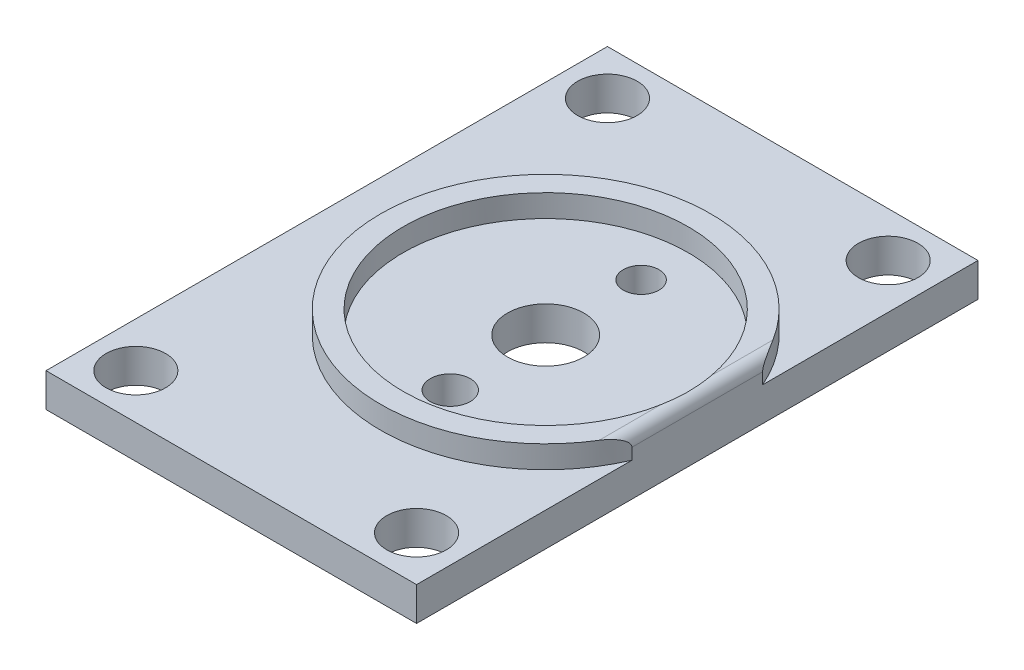
ISO-10303-21;
HEADER;
FILE_DESCRIPTION(('STEP AP214'),'2;1');
FILE_NAME('part.step','',(''),(''),'','','');
FILE_SCHEMA(('AUTOMOTIVE_DESIGN { 1 0 10303 214 1 1 1 1 }'));
ENDSEC;
DATA;
#1=APPLICATION_CONTEXT('core data for automotive mechanical design processes');
#2=APPLICATION_PROTOCOL_DEFINITION('international standard','automotive_design',2000,#1);
#3=PRODUCT_CONTEXT('',#1,'mechanical');
#4=PRODUCT('Part','Part','',(#3));
#5=PRODUCT_RELATED_PRODUCT_CATEGORY('part','',(#4));
#6=PRODUCT_DEFINITION_FORMATION('','',#4);
#7=PRODUCT_DEFINITION_CONTEXT('part definition',#1,'design');
#8=PRODUCT_DEFINITION('design','',#6,#7);
#9=PRODUCT_DEFINITION_SHAPE('','',#8);
#10=(LENGTH_UNIT() NAMED_UNIT(*) SI_UNIT(.MILLI.,.METRE.));
#11=(NAMED_UNIT(*) PLANE_ANGLE_UNIT() SI_UNIT($,.RADIAN.));
#12=(NAMED_UNIT(*) SI_UNIT($,.STERADIAN.) SOLID_ANGLE_UNIT());
#13=UNCERTAINTY_MEASURE_WITH_UNIT(LENGTH_MEASURE(1.E-05),#10,'distance_accuracy_value','');
#14=(GEOMETRIC_REPRESENTATION_CONTEXT(3) GLOBAL_UNCERTAINTY_ASSIGNED_CONTEXT((#13)) GLOBAL_UNIT_ASSIGNED_CONTEXT((#10,
#11,#12)) REPRESENTATION_CONTEXT('',''));
#15=CARTESIAN_POINT('',(0.,0.,0.));
#16=DIRECTION('',(0.,0.,1.));
#17=DIRECTION('',(1.,0.,0.));
#18=AXIS2_PLACEMENT_3D('',#15,#16,#17);
#19=CARTESIAN_POINT('',(0.,3.,0.));
#20=DIRECTION('',(0.,1.,0.));
#21=DIRECTION('',(0.,0.,1.));
#22=AXIS2_PLACEMENT_3D('',#19,#20,#21);
#23=PLANE('',#22);
#24=CARTESIAN_POINT('',(1.27695167286245,3.,-19.8847583643123));
#25=DIRECTION('',(0.,1.,0.));
#26=DIRECTION('',(0.,0.,1.));
#27=AXIS2_PLACEMENT_3D('',#24,#25,#26);
#28=CIRCLE('',#27,1.58978016760219);
#29=CARTESIAN_POINT('',(1.27695167286245,3.,-18.2949781967101));
#30=VERTEX_POINT('',#29);
#31=EDGE_CURVE('E253',#30,#30,#28,.T.);
#32=ORIENTED_EDGE('',*,*,#31,.F.);
#33=EDGE_LOOP('',(#32));
#34=FACE_BOUND('',#33,.T.);
#35=CARTESIAN_POINT('',(1.27695167286245,3.,-2.88475836431227));
#36=DIRECTION('',(0.,1.,0.));
#37=DIRECTION('',(0.,0.,1.));
#38=AXIS2_PLACEMENT_3D('',#35,#36,#37);
#39=CIRCLE('',#38,1.77742826201975);
#40=CARTESIAN_POINT('',(1.27695167286245,3.,-1.10733010229252));
#41=VERTEX_POINT('',#40);
#42=EDGE_CURVE('E257',#41,#41,#39,.T.);
#43=ORIENTED_EDGE('',*,*,#42,.F.);
#44=EDGE_LOOP('',(#43));
#45=FACE_BOUND('',#44,.T.);
#46=CARTESIAN_POINT('',(1.27695167286245,3.,-11.3847583643123));
#47=DIRECTION('',(0.,1.,0.));
#48=DIRECTION('',(0.,0.,1.));
#49=AXIS2_PLACEMENT_3D('',#46,#47,#48);
#50=CIRCLE('',#49,3.4);
#51=CARTESIAN_POINT('',(1.27695167286245,3.,-7.98475836431227));
#52=VERTEX_POINT('',#51);
#53=EDGE_CURVE('E151',#52,#52,#50,.T.);
#54=ORIENTED_EDGE('',*,*,#53,.F.);
#55=EDGE_LOOP('',(#54));
#56=FACE_BOUND('',#55,.T.);
#57=CARTESIAN_POINT('',(1.27695167286245,3.,-11.3847583643123));
#58=DIRECTION('',(0.,1.,0.));
#59=DIRECTION('',(0.,0.,1.));
#60=AXIS2_PLACEMENT_3D('',#57,#58,#59);
#61=CIRCLE('',#60,12.7);
#62=CARTESIAN_POINT('',(1.27695167286245,3.,1.31524163568773));
#63=VERTEX_POINT('',#62);
#64=EDGE_CURVE('E262',#63,#63,#61,.T.);
#65=ORIENTED_EDGE('',*,*,#64,.T.);
#66=EDGE_LOOP('',(#65));
#67=FACE_BOUND('',#66,.T.);
#68=ADVANCED_FACE('F41',(#34,#45,#56,#67),#23,.T.);
#69=CARTESIAN_POINT('',(0.,0.,0.));
#70=DIRECTION('',(0.,1.,0.));
#71=DIRECTION('',(0.,0.,1.));
#72=AXIS2_PLACEMENT_3D('',#69,#70,#71);
#73=PLANE('',#72);
#74=CARTESIAN_POINT('',(1.27695167286245,0.,-19.8847583643123));
#75=DIRECTION('',(0.,1.,0.));
#76=DIRECTION('',(0.,0.,1.));
#77=AXIS2_PLACEMENT_3D('',#74,#75,#76);
#78=CIRCLE('',#77,1.58978016760219);
#79=CARTESIAN_POINT('',(1.27695167286245,0.,-18.2949781967101));
#80=VERTEX_POINT('',#79);
#81=EDGE_CURVE('E266',#80,#80,#78,.T.);
#82=ORIENTED_EDGE('',*,*,#81,.T.);
#83=EDGE_LOOP('',(#82));
#84=FACE_BOUND('',#83,.T.);
#85=CARTESIAN_POINT('',(1.27695167286245,0.,-2.88475836431227));
#86=DIRECTION('',(0.,1.,0.));
#87=DIRECTION('',(0.,0.,1.));
#88=AXIS2_PLACEMENT_3D('',#85,#86,#87);
#89=CIRCLE('',#88,1.77742826201975);
#90=CARTESIAN_POINT('',(1.27695167286245,0.,-1.10733010229252));
#91=VERTEX_POINT('',#90);
#92=EDGE_CURVE('E274',#91,#91,#89,.T.);
#93=ORIENTED_EDGE('',*,*,#92,.T.);
#94=EDGE_LOOP('',(#93));
#95=FACE_BOUND('',#94,.T.);
#96=CARTESIAN_POINT('',(10.7769516728624,0.,-32.3847583643123));
#97=DIRECTION('',(0.,1.,0.));
#98=DIRECTION('',(0.,0.,1.));
#99=AXIS2_PLACEMENT_3D('',#96,#97,#98);
#100=CIRCLE('',#99,2.65);
#101=CARTESIAN_POINT('',(10.7769516728624,0.,-29.7347583643123));
#102=VERTEX_POINT('',#101);
#103=EDGE_CURVE('E297',#102,#102,#100,.F.);
#104=ORIENTED_EDGE('',*,*,#103,.F.);
#105=EDGE_LOOP('',(#104));
#106=FACE_BOUND('',#105,.T.);
#107=CARTESIAN_POINT('',(10.7769516728625,0.,9.61524163568773));
#108=DIRECTION('',(0.,1.,0.));
#109=DIRECTION('',(0.,0.,1.));
#110=AXIS2_PLACEMENT_3D('',#107,#108,#109);
#111=CIRCLE('',#110,2.65);
#112=CARTESIAN_POINT('',(10.7769516728625,0.,12.2652416356877));
#113=VERTEX_POINT('',#112);
#114=EDGE_CURVE('E290',#113,#113,#111,.F.);
#115=ORIENTED_EDGE('',*,*,#114,.F.);
#116=EDGE_LOOP('',(#115));
#117=FACE_BOUND('',#116,.T.);
#118=CARTESIAN_POINT('',(1.27695167286245,0.,-11.3847583643123));
#119=DIRECTION('',(0.,1.,0.));
#120=DIRECTION('',(0.,0.,1.));
#121=AXIS2_PLACEMENT_3D('',#118,#119,#120);
#122=CIRCLE('',#121,3.4);
#123=CARTESIAN_POINT('',(1.27695167286245,0.,-7.98475836431227));
#124=VERTEX_POINT('',#123);
#125=EDGE_CURVE('E150',#124,#124,#122,.T.);
#126=ORIENTED_EDGE('',*,*,#125,.T.);
#127=EDGE_LOOP('',(#126));
#128=FACE_BOUND('',#127,.T.);
#129=DIRECTION('',(1.,0.,0.));
#130=VECTOR('',#129,1.);
#131=CARTESIAN_POINT('',(-10.2230483271375,0.,13.6152416356877));
#132=LINE('',#131,#130);
#133=CARTESIAN_POINT('',(-18.2230483271375,0.,13.6152416356877));
#134=VERTEX_POINT('',#133);
#135=CARTESIAN_POINT('',(14.7769516728625,0.,13.6152416356877));
#136=VERTEX_POINT('',#135);
#137=EDGE_CURVE('E127',#134,#136,#132,.T.);
#138=ORIENTED_EDGE('',*,*,#137,.F.);
#139=DIRECTION('',(0.,0.,1.));
#140=VECTOR('',#139,1.);
#141=CARTESIAN_POINT('',(-18.2230483271375,0.,-36.3847583643123));
#142=LINE('',#141,#140);
#143=CARTESIAN_POINT('',(-18.2230483271375,0.,-36.3847583643123));
#144=VERTEX_POINT('',#143);
#145=EDGE_CURVE('E124',#144,#134,#142,.T.);
#146=ORIENTED_EDGE('',*,*,#145,.F.);
#147=DIRECTION('',(-1.,0.,0.));
#148=VECTOR('',#147,1.);
#149=CARTESIAN_POINT('',(-10.2230483271376,0.,-36.3847583643123));
#150=LINE('',#149,#148);
#151=CARTESIAN_POINT('',(14.7769516728625,0.,-36.3847583643123));
#152=VERTEX_POINT('',#151);
#153=EDGE_CURVE('E109',#152,#144,#150,.T.);
#154=ORIENTED_EDGE('',*,*,#153,.F.);
#155=DIRECTION('',(0.,0.,-1.));
#156=VECTOR('',#155,1.);
#157=CARTESIAN_POINT('',(14.7769516728625,0.,-36.3847583643123));
#158=LINE('',#157,#156);
#159=EDGE_CURVE('E121',#136,#152,#158,.T.);
#160=ORIENTED_EDGE('',*,*,#159,.F.);
#161=EDGE_LOOP('',(#138,#146,#154,#160));
#162=FACE_BOUND('',#161,.T.);
#163=CARTESIAN_POINT('',(-14.2230483271375,0.,-32.3847583643123));
#164=DIRECTION('',(0.,1.,0.));
#165=DIRECTION('',(0.,0.,1.));
#166=AXIS2_PLACEMENT_3D('',#163,#164,#165);
#167=CIRCLE('',#166,2.65);
#168=CARTESIAN_POINT('',(-14.2230483271375,0.,-29.7347583643123));
#169=VERTEX_POINT('',#168);
#170=EDGE_CURVE('E46',#169,#169,#167,.F.);
#171=ORIENTED_EDGE('',*,*,#170,.F.);
#172=EDGE_LOOP('',(#171));
#173=FACE_BOUND('',#172,.T.);
#174=CARTESIAN_POINT('',(-14.2230483271375,0.,9.61524163568773));
#175=DIRECTION('',(0.,1.,0.));
#176=DIRECTION('',(0.,0.,1.));
#177=AXIS2_PLACEMENT_3D('',#174,#175,#176);
#178=CIRCLE('',#177,2.65);
#179=CARTESIAN_POINT('',(-14.2230483271375,0.,12.2652416356877));
#180=VERTEX_POINT('',#179);
#181=EDGE_CURVE('E322',#180,#180,#178,.F.);
#182=ORIENTED_EDGE('',*,*,#181,.F.);
#183=EDGE_LOOP('',(#182));
#184=FACE_BOUND('',#183,.T.);
#185=ADVANCED_FACE('F125',(#84,#95,#106,#117,#128,#162,#173,#184),#73,.F.);
#186=CARTESIAN_POINT('',(1.27695167286245,3.,-11.3847583643123));
#187=DIRECTION('',(0.,1.,0.));
#188=DIRECTION('',(0.,0.,1.));
#189=AXIS2_PLACEMENT_3D('',#186,#187,#188);
#190=CIRCLE('',#189,14.7);
#191=CARTESIAN_POINT('',(14.7769516728625,3.,-17.2019741932119));
#192=VERTEX_POINT('',#191);
#193=CARTESIAN_POINT('',(14.7769516728625,3.,-5.56754253541269));
#194=VERTEX_POINT('',#193);
#195=EDGE_CURVE('E265',#192,#194,#190,.T.);
#196=ORIENTED_EDGE('',*,*,#195,.F.);
#197=DIRECTION('',(0.,0.,-1.));
#198=VECTOR('',#197,1.);
#199=CARTESIAN_POINT('',(14.7769516728625,3.,-36.3847583643123));
#200=LINE('',#199,#198);
#201=CARTESIAN_POINT('',(14.7769516728625,3.,-36.3847583643123));
#202=VERTEX_POINT('',#201);
#203=EDGE_CURVE('E160',#192,#202,#200,.T.);
#204=ORIENTED_EDGE('',*,*,#203,.T.);
#205=DIRECTION('',(-1.,0.,0.));
#206=VECTOR('',#205,1.);
#207=CARTESIAN_POINT('',(-10.2230483271376,3.,-36.3847583643123));
#208=LINE('',#207,#206);
#209=CARTESIAN_POINT('',(-18.2230483271376,3.,-36.3847583643123));
#210=VERTEX_POINT('',#209);
#211=EDGE_CURVE('E165',#202,#210,#208,.T.);
#212=ORIENTED_EDGE('',*,*,#211,.T.);
#213=DIRECTION('',(0.,0.,-1.));
#214=VECTOR('',#213,1.);
#215=CARTESIAN_POINT('',(-18.2230483271376,3.,-36.3847583643123));
#216=LINE('',#215,#214);
#217=CARTESIAN_POINT('',(-18.2230483271375,3.,13.6152416356877));
#218=VERTEX_POINT('',#217);
#219=EDGE_CURVE('E135',#218,#210,#216,.T.);
#220=ORIENTED_EDGE('',*,*,#219,.F.);
#221=DIRECTION('',(1.,0.,0.));
#222=VECTOR('',#221,1.);
#223=CARTESIAN_POINT('',(-10.2230483271375,3.,13.6152416356877));
#224=LINE('',#223,#222);
#225=CARTESIAN_POINT('',(14.7769516728625,3.,13.6152416356877));
#226=VERTEX_POINT('',#225);
#227=EDGE_CURVE('E120',#218,#226,#224,.T.);
#228=ORIENTED_EDGE('',*,*,#227,.T.);
#229=EDGE_CURVE('E161',#226,#194,#200,.T.);
#230=ORIENTED_EDGE('',*,*,#229,.T.);
#231=EDGE_LOOP('',(#196,#204,#212,#220,#228,#230));
#232=FACE_BOUND('',#231,.T.);
#233=CARTESIAN_POINT('',(10.7769516728624,3.,-32.3847583643123));
#234=DIRECTION('',(0.,-1.,0.));
#235=DIRECTION('',(0.,0.,1.));
#236=AXIS2_PLACEMENT_3D('',#233,#234,#235);
#237=CIRCLE('',#236,2.65);
#238=CARTESIAN_POINT('',(10.7769516728624,3.,-29.7347583643123));
#239=VERTEX_POINT('',#238);
#240=EDGE_CURVE('E286',#239,#239,#237,.T.);
#241=ORIENTED_EDGE('',*,*,#240,.T.);
#242=EDGE_LOOP('',(#241));
#243=FACE_BOUND('',#242,.T.);
#244=CARTESIAN_POINT('',(10.7769516728625,3.,9.61524163568773));
#245=DIRECTION('',(0.,-1.,0.));
#246=DIRECTION('',(0.,0.,1.));
#247=AXIS2_PLACEMENT_3D('',#244,#245,#246);
#248=CIRCLE('',#247,2.65);
#249=CARTESIAN_POINT('',(10.7769516728625,3.,12.2652416356877));
#250=VERTEX_POINT('',#249);
#251=EDGE_CURVE('E285',#250,#250,#248,.T.);
#252=ORIENTED_EDGE('',*,*,#251,.T.);
#253=EDGE_LOOP('',(#252));
#254=FACE_BOUND('',#253,.T.);
#255=CARTESIAN_POINT('',(-14.2230483271375,3.,-32.3847583643123));
#256=DIRECTION('',(0.,1.,0.));
#257=DIRECTION('',(0.,0.,1.));
#258=AXIS2_PLACEMENT_3D('',#255,#256,#257);
#259=CIRCLE('',#258,2.65);
#260=CARTESIAN_POINT('',(-14.2230483271375,3.,-29.7347583643123));
#261=VERTEX_POINT('',#260);
#262=EDGE_CURVE('E138',#261,#261,#259,.T.);
#263=ORIENTED_EDGE('',*,*,#262,.F.);
#264=EDGE_LOOP('',(#263));
#265=FACE_BOUND('',#264,.T.);
#266=CARTESIAN_POINT('',(-14.2230483271375,3.,9.61524163568773));
#267=DIRECTION('',(0.,1.,0.));
#268=DIRECTION('',(0.,0.,1.));
#269=AXIS2_PLACEMENT_3D('',#266,#267,#268);
#270=CIRCLE('',#269,2.65);
#271=CARTESIAN_POINT('',(-14.2230483271375,3.,12.2652416356877));
#272=VERTEX_POINT('',#271);
#273=EDGE_CURVE('E144',#272,#272,#270,.T.);
#274=ORIENTED_EDGE('',*,*,#273,.F.);
#275=EDGE_LOOP('',(#274));
#276=FACE_BOUND('',#275,.T.);
#277=ADVANCED_FACE('F230',(#232,#243,#254,#265,#276),#23,.T.);
#278=CARTESIAN_POINT('',(-10.2230483271375,3.,13.6152416356877));
#279=DIRECTION('',(0.,0.,-1.));
#280=DIRECTION('',(-1.,0.,0.));
#281=AXIS2_PLACEMENT_3D('',#278,#279,#280);
#282=PLANE('',#281);
#283=DIRECTION('',(0.,1.,0.));
#284=VECTOR('',#283,1.);
#285=CARTESIAN_POINT('',(-18.2230483271375,3.,13.6152416356877));
#286=LINE('',#285,#284);
#287=EDGE_CURVE('E137',#134,#218,#286,.T.);
#288=ORIENTED_EDGE('',*,*,#287,.F.);
#289=ORIENTED_EDGE('',*,*,#137,.T.);
#290=DIRECTION('',(0.,-1.,0.));
#291=VECTOR('',#290,1.);
#292=CARTESIAN_POINT('',(14.7769516728625,3.,13.6152416356877));
#293=LINE('',#292,#291);
#294=EDGE_CURVE('E174',#226,#136,#293,.T.);
#295=ORIENTED_EDGE('',*,*,#294,.F.);
#296=ORIENTED_EDGE('',*,*,#227,.F.);
#297=EDGE_LOOP('',(#288,#289,#295,#296));
#298=FACE_BOUND('',#297,.T.);
#299=ADVANCED_FACE('F233',(#298),#282,.F.);
#300=CARTESIAN_POINT('',(14.7769516728625,3.,-36.3847583643123));
#301=DIRECTION('',(-1.,0.,0.));
#302=DIRECTION('',(0.,0.,1.));
#303=AXIS2_PLACEMENT_3D('',#300,#301,#302);
#304=PLANE('',#303);
#305=DIRECTION('',(0.,-1.,0.));
#306=VECTOR('',#305,1.);
#307=CARTESIAN_POINT('',(14.7769516728625,5.,-17.2019741932119));
#308=LINE('',#307,#306);
#309=CARTESIAN_POINT('',(14.7769516728625,4.,-17.2019741932119));
#310=VERTEX_POINT('',#309);
#311=EDGE_CURVE('E282',#310,#192,#308,.T.);
#312=ORIENTED_EDGE('',*,*,#311,.F.);
#313=DIRECTION('',(0.,0.,-1.));
#314=VECTOR('',#313,1.);
#315=CARTESIAN_POINT('',(14.7769516728625,4.,-5.56754253541269));
#316=LINE('',#315,#314);
#317=CARTESIAN_POINT('',(14.7769516728625,4.,-5.56754253541269));
#318=VERTEX_POINT('',#317);
#319=EDGE_CURVE('E11',#310,#318,#316,.F.);
#320=ORIENTED_EDGE('',*,*,#319,.T.);
#321=DIRECTION('',(0.,-1.,0.));
#322=VECTOR('',#321,1.);
#323=CARTESIAN_POINT('',(14.7769516728625,5.,-5.56754253541269));
#324=LINE('',#323,#322);
#325=EDGE_CURVE('E279',#318,#194,#324,.T.);
#326=ORIENTED_EDGE('',*,*,#325,.T.);
#327=ORIENTED_EDGE('',*,*,#229,.F.);
#328=ORIENTED_EDGE('',*,*,#294,.T.);
#329=ORIENTED_EDGE('',*,*,#159,.T.);
#330=DIRECTION('',(0.,-1.,0.));
#331=VECTOR('',#330,1.);
#332=CARTESIAN_POINT('',(14.7769516728625,3.,-36.3847583643123));
#333=LINE('',#332,#331);
#334=EDGE_CURVE('E116',#202,#152,#333,.T.);
#335=ORIENTED_EDGE('',*,*,#334,.F.);
#336=ORIENTED_EDGE('',*,*,#203,.F.);
#337=EDGE_LOOP('',(#312,#320,#326,#327,#328,#329,#335,#336));
#338=FACE_BOUND('',#337,.T.);
#339=ADVANCED_FACE('F240',(#338),#304,.F.);
#340=CARTESIAN_POINT('',(-10.2230483271376,3.,-36.3847583643123));
#341=DIRECTION('',(0.,0.,1.));
#342=DIRECTION('',(1.,0.,0.));
#343=AXIS2_PLACEMENT_3D('',#340,#341,#342);
#344=PLANE('',#343);
#345=ORIENTED_EDGE('',*,*,#153,.T.);
#346=DIRECTION('',(0.,-1.,0.));
#347=VECTOR('',#346,1.);
#348=CARTESIAN_POINT('',(-18.2230483271376,3.,-36.3847583643123));
#349=LINE('',#348,#347);
#350=EDGE_CURVE('E114',#210,#144,#349,.T.);
#351=ORIENTED_EDGE('',*,*,#350,.F.);
#352=ORIENTED_EDGE('',*,*,#211,.F.);
#353=ORIENTED_EDGE('',*,*,#334,.T.);
#354=EDGE_LOOP('',(#345,#351,#352,#353));
#355=FACE_BOUND('',#354,.T.);
#356=ADVANCED_FACE('F111',(#355),#344,.F.);
#357=CARTESIAN_POINT('',(1.27695167286245,3.,-11.3847583643123));
#358=DIRECTION('',(0.,-1.,0.));
#359=DIRECTION('',(0.,0.,-1.));
#360=AXIS2_PLACEMENT_3D('',#357,#358,#359);
#361=CYLINDRICAL_SURFACE('',#360,3.4);
#362=ORIENTED_EDGE('',*,*,#53,.T.);
#363=EDGE_LOOP('',(#362));
#364=FACE_BOUND('',#363,.T.);
#365=ORIENTED_EDGE('',*,*,#125,.F.);
#366=EDGE_LOOP('',(#365));
#367=FACE_BOUND('',#366,.T.);
#368=ADVANCED_FACE('F226',(#364,#367),#361,.F.);
#369=CARTESIAN_POINT('',(-18.2230483271375,0.,0.));
#370=DIRECTION('',(-1.,0.,0.));
#371=DIRECTION('',(0.,0.,1.));
#372=AXIS2_PLACEMENT_3D('',#369,#370,#371);
#373=PLANE('',#372);
#374=ORIENTED_EDGE('',*,*,#145,.T.);
#375=ORIENTED_EDGE('',*,*,#287,.T.);
#376=ORIENTED_EDGE('',*,*,#219,.T.);
#377=ORIENTED_EDGE('',*,*,#350,.T.);
#378=EDGE_LOOP('',(#374,#375,#376,#377));
#379=FACE_BOUND('',#378,.T.);
#380=ADVANCED_FACE('F133',(#379),#373,.T.);
#381=CARTESIAN_POINT('',(-14.2230483271375,-0.3,9.61524163568773));
#382=DIRECTION('',(0.,1.,0.));
#383=DIRECTION('',(0.,0.,1.));
#384=AXIS2_PLACEMENT_3D('',#381,#382,#383);
#385=CYLINDRICAL_SURFACE('',#384,2.65);
#386=ORIENTED_EDGE('',*,*,#181,.T.);
#387=EDGE_LOOP('',(#386));
#388=FACE_BOUND('',#387,.T.);
#389=ORIENTED_EDGE('',*,*,#273,.T.);
#390=EDGE_LOOP('',(#389));
#391=FACE_BOUND('',#390,.T.);
#392=ADVANCED_FACE('F219',(#388,#391),#385,.F.);
#393=CARTESIAN_POINT('',(-14.2230483271375,-0.3,-32.3847583643123));
#394=DIRECTION('',(0.,1.,0.));
#395=DIRECTION('',(0.,0.,1.));
#396=AXIS2_PLACEMENT_3D('',#393,#394,#395);
#397=CYLINDRICAL_SURFACE('',#396,2.65);
#398=ORIENTED_EDGE('',*,*,#170,.T.);
#399=EDGE_LOOP('',(#398));
#400=FACE_BOUND('',#399,.T.);
#401=ORIENTED_EDGE('',*,*,#262,.T.);
#402=EDGE_LOOP('',(#401));
#403=FACE_BOUND('',#402,.T.);
#404=ADVANCED_FACE('F215',(#400,#403),#397,.F.);
#405=CARTESIAN_POINT('',(10.7769516728625,-0.3,9.61524163568773));
#406=DIRECTION('',(0.,1.,0.));
#407=DIRECTION('',(0.,0.,1.));
#408=AXIS2_PLACEMENT_3D('',#405,#406,#407);
#409=CYLINDRICAL_SURFACE('',#408,2.65);
#410=ORIENTED_EDGE('',*,*,#251,.F.);
#411=EDGE_LOOP('',(#410));
#412=FACE_BOUND('',#411,.T.);
#413=ORIENTED_EDGE('',*,*,#114,.T.);
#414=EDGE_LOOP('',(#413));
#415=FACE_BOUND('',#414,.T.);
#416=ADVANCED_FACE('F211',(#412,#415),#409,.F.);
#417=CARTESIAN_POINT('',(10.7769516728624,-0.3,-32.3847583643123));
#418=DIRECTION('',(0.,1.,0.));
#419=DIRECTION('',(0.,0.,1.));
#420=AXIS2_PLACEMENT_3D('',#417,#418,#419);
#421=CYLINDRICAL_SURFACE('',#420,2.65);
#422=ORIENTED_EDGE('',*,*,#240,.F.);
#423=EDGE_LOOP('',(#422));
#424=FACE_BOUND('',#423,.T.);
#425=ORIENTED_EDGE('',*,*,#103,.T.);
#426=EDGE_LOOP('',(#425));
#427=FACE_BOUND('',#426,.T.);
#428=ADVANCED_FACE('F205',(#424,#427),#421,.F.);
#429=CARTESIAN_POINT('',(1.27695167286245,5.,-11.3847583643123));
#430=DIRECTION('',(0.,-1.,0.));
#431=DIRECTION('',(0.,0.,-1.));
#432=AXIS2_PLACEMENT_3D('',#429,#430,#431);
#433=CYLINDRICAL_SURFACE('',#432,12.7);
#434=CARTESIAN_POINT('',(1.27695167286245,5.,-11.3847583643123));
#435=DIRECTION('',(0.,1.,0.));
#436=DIRECTION('',(0.,0.,1.));
#437=AXIS2_PLACEMENT_3D('',#434,#435,#436);
#438=CIRCLE('',#437,12.7);
#439=CARTESIAN_POINT('',(13.7769516728625,5.,-13.6297527963766));
#440=VERTEX_POINT('',#439);
#441=CARTESIAN_POINT('',(13.7769516728625,5.,-9.13976393224791));
#442=VERTEX_POINT('',#441);
#443=EDGE_CURVE('E271',#440,#442,#438,.T.);
#444=ORIENTED_EDGE('',*,*,#443,.T.);
#445=CARTESIAN_POINT('',(13.7769516728625,5.,-9.13976393224791));
#446=CARTESIAN_POINT('',(13.7917982648946,4.99999666393264,-9.22242883608441));
#447=CARTESIAN_POINT('',(13.8058241827349,4.99966981555627,-9.30523762198722));
#448=CARTESIAN_POINT('',(13.8322299971182,4.99855905949372,-9.47111282776791));
#449=CARTESIAN_POINT('',(13.8446099229139,4.99777515993167,-9.5541792430403));
#450=CARTESIAN_POINT('',(13.8792729985578,4.99502291514125,-9.80371369877026));
#451=CARTESIAN_POINT('',(13.8990813141116,4.99265397562916,-9.97052734806752));
#452=CARTESIAN_POINT('',(13.9319490481331,4.98805312892272,-10.3036234391423));
#453=CARTESIAN_POINT('',(13.9450552287151,4.9858203707205,-10.4699012877852));
#454=CARTESIAN_POINT('',(13.9647095921097,4.982265656693,-10.8028559893748));
#455=CARTESIAN_POINT('',(13.9712577108323,4.98094370976884,-10.969532846205));
#456=CARTESIAN_POINT('',(13.9785871566708,4.97947302630847,-11.3440895614154));
#457=CARTESIAN_POINT('',(13.9775513656986,4.97969334915199,-11.5520086493808));
#458=CARTESIAN_POINT('',(13.9652751859536,4.98212691271205,-11.9675603732358));
#459=CARTESIAN_POINT('',(13.9540336743221,4.98434037271823,-12.1751929750881));
#460=CARTESIAN_POINT('',(13.9294696825212,4.98833327170211,-12.486931647102));
#461=CARTESIAN_POINT('',(13.9199386892982,4.98978427249376,-12.591354412072));
#462=CARTESIAN_POINT('',(13.8982935093669,4.99267134051921,-12.7999341621755));
#463=CARTESIAN_POINT('',(13.8861793302054,4.99410740779664,-12.9040911480846));
#464=CARTESIAN_POINT('',(13.8593761247133,4.99668878187041,-13.1120644593689));
#465=CARTESIAN_POINT('',(13.8446874005908,4.99783412275453,-13.2158808232718));
#466=CARTESIAN_POINT('',(13.8127427272464,4.99948463129596,-13.4231246441708));
#467=CARTESIAN_POINT('',(13.7954867279227,4.99998978645787,-13.5265520935365));
#468=CARTESIAN_POINT('',(13.7769516728625,5.,-13.6297527963766));
#469=B_SPLINE_CURVE_WITH_KNOTS('',3,(#445,#446,#447,#448,#449,#450,#451,#452,#453,#454,#455,
#456,#457,#458,#459,#460,#461,#462,#463,#464,#465,#466,#467,#468),.UNSPECIFIED.,.F.,.F.,(4,2,2,
2,2,2,2,2,2,2,2,4),(0.,0.251951724219675,0.503898970110917,1.0077617893011,1.50805937515915,
2.00836185023315,2.63186235615105,3.2554314694485,3.57000566075406,3.88457893303305,
4.19911530442203,4.51365781496104),.UNSPECIFIED.);
#470=EDGE_CURVE('E185',#442,#440,#469,.T.);
#471=ORIENTED_EDGE('',*,*,#470,.T.);
#472=EDGE_LOOP('',(#444,#471));
#473=FACE_BOUND('',#472,.T.);
#474=ORIENTED_EDGE('',*,*,#64,.F.);
#475=EDGE_LOOP('',(#474));
#476=FACE_BOUND('',#475,.T.);
#477=ADVANCED_FACE('F200',(#473,#476),#433,.F.);
#478=CARTESIAN_POINT('',(1.27695167286245,5.,-11.3847583643123));
#479=DIRECTION('',(0.,-1.,0.));
#480=DIRECTION('',(0.,0.,-1.));
#481=AXIS2_PLACEMENT_3D('',#478,#479,#480);
#482=CYLINDRICAL_SURFACE('',#481,14.7);
#483=CARTESIAN_POINT('',(1.27695167286245,5.,-11.3847583643123));
#484=DIRECTION('',(0.,1.,0.));
#485=DIRECTION('',(0.,0.,1.));
#486=AXIS2_PLACEMENT_3D('',#483,#484,#485);
#487=CIRCLE('',#486,14.7);
#488=CARTESIAN_POINT('',(13.7769516728625,5.,-19.1203902066378));
#489=VERTEX_POINT('',#488);
#490=CARTESIAN_POINT('',(13.7769516728625,5.,-3.64912652198679));
#491=VERTEX_POINT('',#490);
#492=EDGE_CURVE('E276',#489,#491,#487,.T.);
#493=ORIENTED_EDGE('',*,*,#492,.F.);
#494=CARTESIAN_POINT('',(13.7769516728625,5.,-19.1203902066378));
#495=CARTESIAN_POINT('',(13.804852368223,4.9999954869858,-19.0753061888042));
#496=CARTESIAN_POINT('',(13.832502937192,4.99883293515778,-19.0300797188275));
#497=CARTESIAN_POINT('',(13.8872628706643,4.99427760957824,-18.9394161721947));
#498=CARTESIAN_POINT('',(13.9143722777845,4.9908850121644,-18.8939791124727));
#499=CARTESIAN_POINT('',(13.9949206253484,4.97747619195145,-18.7573055899291));
#500=CARTESIAN_POINT('',(14.0474892285777,4.96422949908699,-18.6658530078683));
#501=CARTESIAN_POINT('',(14.1492391259875,4.92964922229002,-18.484398319347));
#502=CARTESIAN_POINT('',(14.1984584085419,4.90843534248119,-18.3943943606808));
#503=CARTESIAN_POINT('',(14.2940184721401,4.85765630451537,-18.215295886609));
#504=CARTESIAN_POINT('',(14.3403623000959,4.82810017697294,-18.1262004951361));
#505=CARTESIAN_POINT('',(14.4133219773777,4.7722005267082,-17.9824611845864));
#506=CARTESIAN_POINT('',(14.4409190458115,4.74868073896599,-17.9272104270308));
#507=CARTESIAN_POINT('',(14.4948416459913,4.69716517838304,-17.817575200898));
#508=CARTESIAN_POINT('',(14.5211567033167,4.66913867397831,-17.7631997231175));
#509=CARTESIAN_POINT('',(14.5637646785544,4.61777688642314,-17.6738125008723));
#510=CARTESIAN_POINT('',(14.5805473185861,4.59585416926962,-17.6382237395724));
#511=CARTESIAN_POINT('',(14.6131471571876,4.54917205554668,-17.5683958889449));
#512=CARTESIAN_POINT('',(14.6289631897218,4.52440933267153,-17.5341584467005));
#513=CARTESIAN_POINT('',(14.6592067346695,4.47174300492469,-17.4680599708097));
#514=CARTESIAN_POINT('',(14.673645271814,4.44386905591497,-17.4361806273127));
#515=CARTESIAN_POINT('',(14.7008163294829,4.38412106538178,-17.3756637382121));
#516=CARTESIAN_POINT('',(14.713553949372,4.35225956163003,-17.3470165445615));
#517=CARTESIAN_POINT('',(14.7324305007182,4.2959679762253,-17.3042539558129));
#518=CARTESIAN_POINT('',(14.7392995684892,4.27295905041984,-17.2886069801691));
#519=CARTESIAN_POINT('',(14.751674598352,4.22479253232095,-17.2603076781505));
#520=CARTESIAN_POINT('',(14.7571814576979,4.19963636913021,-17.2476533808126));
#521=CARTESIAN_POINT('',(14.7656840546325,4.15136900747075,-17.2280618159638));
#522=CARTESIAN_POINT('',(14.7689364224677,4.12854313994863,-17.2205430785036));
#523=CARTESIAN_POINT('',(14.7738684475927,4.08186303400441,-17.2091277885398));
#524=CARTESIAN_POINT('',(14.7755523157903,4.058011729921,-17.2052215378958));
#525=CARTESIAN_POINT('',(14.7767604298796,4.02268622155709,-17.202417806813));
#526=CARTESIAN_POINT('',(14.7769559862048,4.01134201920128,-17.2019636177184));
#527=CARTESIAN_POINT('',(14.7769516728625,4.,-17.2019741932119));
#528=B_SPLINE_CURVE_WITH_KNOTS('',3,(#494,#495,#496,#497,#498,#499,#500,#501,#502,#503,#504,
#505,#506,#507,#508,#509,#510,#511,#512,#513,#514,#515,#516,#517,#518,#519,#520,#521,#522,#523,
#524,#525,#526,#527),.UNSPECIFIED.,.F.,.F.,(4,2,2,2,2,2,2,2,2,2,2,2,2,2,2,2,4),(0.,
0.159024980973563,0.318037388786538,0.636576370945678,0.950509358150242,1.26410380281102,
1.46223860105219,1.66178674466198,1.79682354994621,1.93202016169716,2.06602332169286,
2.19961525973189,2.28539772771844,2.37112354147929,2.44359284038567,2.51586701742765,
2.54989177646313),.UNSPECIFIED.);
#529=EDGE_CURVE('E52',#489,#310,#528,.T.);
#530=ORIENTED_EDGE('',*,*,#529,.T.);
#531=ORIENTED_EDGE('',*,*,#311,.T.);
#532=ORIENTED_EDGE('',*,*,#195,.T.);
#533=ORIENTED_EDGE('',*,*,#325,.F.);
#534=CARTESIAN_POINT('',(14.7769516728625,4.,-5.56754253541269));
#535=CARTESIAN_POINT('',(14.7769798518988,4.02508472034533,-5.56761243459964));
#536=CARTESIAN_POINT('',(14.7760092835958,4.05006458511525,-5.56535528123019));
#537=CARTESIAN_POINT('',(14.7723404109595,4.09887928973539,-5.55684990943588));
#538=CARTESIAN_POINT('',(14.7696650287718,4.1227248766999,-5.5506546437256));
#539=CARTESIAN_POINT('',(14.7619269452442,4.17525286383017,-5.53278839792091));
#540=CARTESIAN_POINT('',(14.7564157765521,4.20351195595343,-5.52009303598014));
#541=CARTESIAN_POINT('',(14.7436115535946,4.25757530833313,-5.49075020211459));
#542=CARTESIAN_POINT('',(14.7363085276445,4.28336466761049,-5.47408062893565));
#543=CARTESIAN_POINT('',(14.7147915949918,4.34986961273874,-5.42526399701179));
#544=CARTESIAN_POINT('',(14.6993430879138,4.38824106355493,-5.39050895249528));
#545=CARTESIAN_POINT('',(14.6661177265775,4.45926087093653,-5.3166536861603));
#546=CARTESIAN_POINT('',(14.6483356752208,4.49189606092934,-5.27754379590936));
#547=CARTESIAN_POINT('',(14.6099645917568,4.5545434761858,-5.19420107422975));
#548=CARTESIAN_POINT('',(14.5892696013558,4.58426447822653,-5.14980083877377));
#549=CARTESIAN_POINT('',(14.5464392379021,4.63961924897627,-5.0591579118229));
#550=CARTESIAN_POINT('',(14.5243023776408,4.66524870038364,-5.01291333767695));
#551=CARTESIAN_POINT('',(14.4787449739834,4.71314952252371,-4.91904983095133));
#552=CARTESIAN_POINT('',(14.455319369279,4.73540614051953,-4.87142588771329));
#553=CARTESIAN_POINT('',(14.4074270986078,4.7768536532526,-4.77540919531009));
#554=CARTESIAN_POINT('',(14.3829607425843,4.79604545273199,-4.72701667768519));
#555=CARTESIAN_POINT('',(14.3141297776397,4.84519527199521,-4.59276120141797));
#556=CARTESIAN_POINT('',(14.2687613145388,4.87226422372073,-4.50634519875303));
#557=CARTESIAN_POINT('',(14.175394471584,4.91867144936574,-4.33281515970143));
#558=CARTESIAN_POINT('',(14.1273941603675,4.93800395723063,-4.2457006518526));
#559=CARTESIAN_POINT('',(14.0300633469034,4.96875339310511,-4.07327909627499));
#560=CARTESIAN_POINT('',(13.9807823797233,4.98032893967164,-3.9879727499118));
#561=CARTESIAN_POINT('',(13.9053879481181,4.99204271206993,-3.86046200857633));
#562=CARTESIAN_POINT('',(13.8800257120169,4.99500563001926,-3.81805704559709));
#563=CARTESIAN_POINT('',(13.8288320653197,4.99898261568122,-3.73343525330129));
#564=CARTESIAN_POINT('',(13.8030006172307,4.99999652695852,-3.69121843935764));
#565=CARTESIAN_POINT('',(13.7769516728625,5.,-3.64912652198679));
#566=B_SPLINE_CURVE_WITH_KNOTS('',3,(#534,#535,#536,#537,#538,#539,#540,#541,#542,#543,#544,
#545,#546,#547,#548,#549,#550,#551,#552,#553,#554,#555,#556,#557,#558,#559,#560,#561,#562,#563,
#564,#565),.UNSPECIFIED.,.F.,.F.,(4,2,2,2,2,2,2,2,2,2,2,2,2,2,2,4),(0.,0.0749653757653962,
0.148943478130678,0.242811691648729,0.337214626075225,0.498387562477841,0.659925744441139,
0.831555403665578,1.00336498199469,1.17590561400697,1.3483952170576,1.65184760098335,
1.95552573187475,2.25278740598212,2.40125065292326,2.54972581564212),.UNSPECIFIED.);
#567=EDGE_CURVE('E193',#318,#491,#566,.T.);
#568=ORIENTED_EDGE('',*,*,#567,.T.);
#569=EDGE_LOOP('',(#493,#530,#531,#532,#533,#568));
#570=FACE_BOUND('',#569,.T.);
#571=ADVANCED_FACE('F204',(#570),#482,.T.);
#572=CARTESIAN_POINT('',(0.,5.,0.));
#573=DIRECTION('',(0.,1.,0.));
#574=DIRECTION('',(0.,0.,1.));
#575=AXIS2_PLACEMENT_3D('',#572,#573,#574);
#576=PLANE('',#575);
#577=ORIENTED_EDGE('',*,*,#492,.T.);
#578=DIRECTION('',(0.,0.,-1.));
#579=VECTOR('',#578,1.);
#580=CARTESIAN_POINT('',(13.7769516728625,5.,-17.2019741932119));
#581=LINE('',#580,#579);
#582=EDGE_CURVE('E181',#491,#442,#581,.T.);
#583=ORIENTED_EDGE('',*,*,#582,.T.);
#584=ORIENTED_EDGE('',*,*,#443,.F.);
#585=DIRECTION('',(0.,0.,-1.));
#586=VECTOR('',#585,1.);
#587=CARTESIAN_POINT('',(13.7769516728625,5.,-17.2019741932119));
#588=LINE('',#587,#586);
#589=EDGE_CURVE('E178',#440,#489,#588,.T.);
#590=ORIENTED_EDGE('',*,*,#589,.T.);
#591=EDGE_LOOP('',(#577,#583,#584,#590));
#592=FACE_BOUND('',#591,.T.);
#593=ADVANCED_FACE('F350',(#592),#576,.T.);
#594=CARTESIAN_POINT('',(13.7769516728625,4.,0.));
#595=DIRECTION('',(0.,0.,1.));
#596=DIRECTION('',(1.,0.,0.));
#597=AXIS2_PLACEMENT_3D('',#594,#595,#596);
#598=CYLINDRICAL_SURFACE('',#597,1.);
#599=ORIENTED_EDGE('',*,*,#567,.F.);
#600=ORIENTED_EDGE('',*,*,#319,.F.);
#601=ORIENTED_EDGE('',*,*,#529,.F.);
#602=ORIENTED_EDGE('',*,*,#589,.F.);
#603=ORIENTED_EDGE('',*,*,#470,.F.);
#604=ORIENTED_EDGE('',*,*,#582,.F.);
#605=EDGE_LOOP('',(#599,#600,#601,#602,#603,#604));
#606=FACE_BOUND('',#605,.T.);
#607=ADVANCED_FACE('F43',(#606),#598,.T.);
#608=CARTESIAN_POINT('',(1.27695167286245,-7.,-2.88475836431227));
#609=DIRECTION('',(0.,1.,0.));
#610=DIRECTION('',(0.,0.,1.));
#611=AXIS2_PLACEMENT_3D('',#608,#609,#610);
#612=CYLINDRICAL_SURFACE('',#611,1.77742826201975);
#613=ORIENTED_EDGE('',*,*,#42,.T.);
#614=EDGE_LOOP('',(#613));
#615=FACE_BOUND('',#614,.T.);
#616=ORIENTED_EDGE('',*,*,#92,.F.);
#617=EDGE_LOOP('',(#616));
#618=FACE_BOUND('',#617,.T.);
#619=ADVANCED_FACE('F353',(#615,#618),#612,.F.);
#620=CARTESIAN_POINT('',(1.27695167286245,-7.,-19.8847583643123));
#621=DIRECTION('',(0.,1.,0.));
#622=DIRECTION('',(0.,0.,1.));
#623=AXIS2_PLACEMENT_3D('',#620,#621,#622);
#624=CYLINDRICAL_SURFACE('',#623,1.58978016760219);
#625=ORIENTED_EDGE('',*,*,#31,.T.);
#626=EDGE_LOOP('',(#625));
#627=FACE_BOUND('',#626,.T.);
#628=ORIENTED_EDGE('',*,*,#81,.F.);
#629=EDGE_LOOP('',(#628));
#630=FACE_BOUND('',#629,.T.);
#631=ADVANCED_FACE('F358',(#627,#630),#624,.F.);
#632=CLOSED_SHELL('',(#68,#185,#277,#299,#339,#356,#368,#380,#392,#404,#416,#428,#477,#571,#593,
#607,#619,#631));
#633=MANIFOLD_SOLID_BREP('B2',#632);
#634=ADVANCED_BREP_SHAPE_REPRESENTATION('',(#18,#633),#14);
#635=SHAPE_DEFINITION_REPRESENTATION(#9,#634);
ENDSEC;
END-ISO-10303-21;
